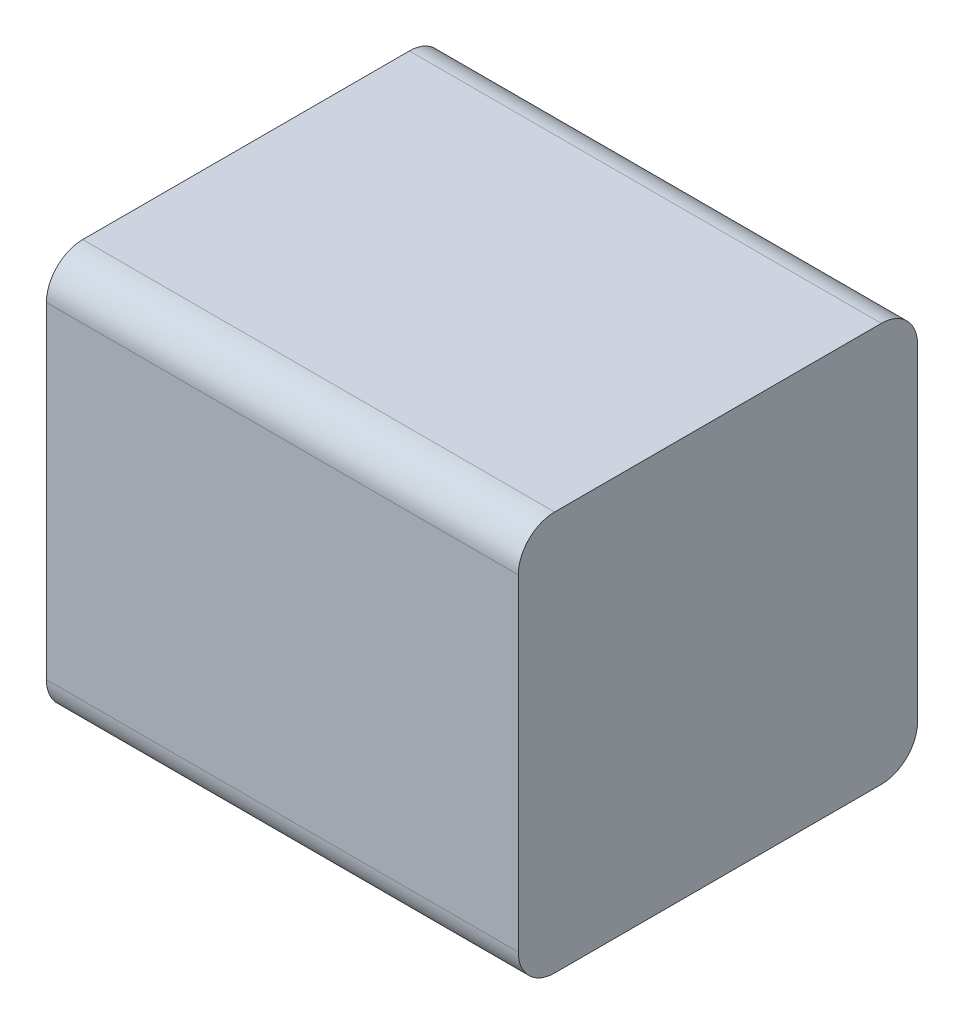
ISO-10303-21;
HEADER;
FILE_DESCRIPTION(('STEP AP214'),'2;1');
FILE_NAME('part.step','',(''),(''),'','','');
FILE_SCHEMA(('AUTOMOTIVE_DESIGN { 1 0 10303 214 1 1 1 1 }'));
ENDSEC;
DATA;
#1=APPLICATION_CONTEXT('core data for automotive mechanical design processes');
#2=APPLICATION_PROTOCOL_DEFINITION('international standard','automotive_design',2000,#1);
#3=PRODUCT_CONTEXT('',#1,'mechanical');
#4=PRODUCT('Part','Part','',(#3));
#5=PRODUCT_RELATED_PRODUCT_CATEGORY('part','',(#4));
#6=PRODUCT_DEFINITION_FORMATION('','',#4);
#7=PRODUCT_DEFINITION_CONTEXT('part definition',#1,'design');
#8=PRODUCT_DEFINITION('design','',#6,#7);
#9=PRODUCT_DEFINITION_SHAPE('','',#8);
#10=(LENGTH_UNIT() NAMED_UNIT(*) SI_UNIT(.MILLI.,.METRE.));
#11=(NAMED_UNIT(*) PLANE_ANGLE_UNIT() SI_UNIT($,.RADIAN.));
#12=(NAMED_UNIT(*) SI_UNIT($,.STERADIAN.) SOLID_ANGLE_UNIT());
#13=UNCERTAINTY_MEASURE_WITH_UNIT(LENGTH_MEASURE(1.E-05),#10,'distance_accuracy_value','');
#14=(GEOMETRIC_REPRESENTATION_CONTEXT(3) GLOBAL_UNCERTAINTY_ASSIGNED_CONTEXT((#13)) GLOBAL_UNIT_ASSIGNED_CONTEXT((#10,
#11,#12)) REPRESENTATION_CONTEXT('',''));
#15=CARTESIAN_POINT('',(0.,0.,0.));
#16=DIRECTION('',(0.,0.,1.));
#17=DIRECTION('',(1.,0.,0.));
#18=AXIS2_PLACEMENT_3D('',#15,#16,#17);
#19=CARTESIAN_POINT('',(0.2,0.,0.));
#20=DIRECTION('',(1.,0.,0.));
#21=DIRECTION('',(0.,0.,-1.));
#22=AXIS2_PLACEMENT_3D('',#19,#20,#21);
#23=PLANE('',#22);
#24=DIRECTION('',(0.,1.,0.));
#25=VECTOR('',#24,1.);
#26=CARTESIAN_POINT('',(0.2,0.,0.55));
#27=LINE('',#26,#25);
#28=CARTESIAN_POINT('',(0.2,0.5,0.55));
#29=VERTEX_POINT('',#28);
#30=CARTESIAN_POINT('',(0.2,0.05,0.55));
#31=VERTEX_POINT('',#30);
#32=EDGE_CURVE('E108',#29,#31,#27,.F.);
#33=ORIENTED_EDGE('',*,*,#32,.F.);
#34=CARTESIAN_POINT('',(0.2,0.5,0.5));
#35=DIRECTION('',(1.,0.,0.));
#36=DIRECTION('',(0.,0.,-1.));
#37=AXIS2_PLACEMENT_3D('',#34,#35,#36);
#38=CIRCLE('',#37,0.05);
#39=CARTESIAN_POINT('',(0.2,0.55,0.5));
#40=VERTEX_POINT('',#39);
#41=EDGE_CURVE('E111',#40,#29,#38,.T.);
#42=ORIENTED_EDGE('',*,*,#41,.F.);
#43=DIRECTION('',(0.,0.,1.));
#44=VECTOR('',#43,1.);
#45=CARTESIAN_POINT('',(0.2,0.55,0.));
#46=LINE('',#45,#44);
#47=CARTESIAN_POINT('',(0.2,0.55,0.05));
#48=VERTEX_POINT('',#47);
#49=EDGE_CURVE('E113',#48,#40,#46,.T.);
#50=ORIENTED_EDGE('',*,*,#49,.F.);
#51=CARTESIAN_POINT('',(0.2,0.5,0.05));
#52=DIRECTION('',(1.,0.,0.));
#53=DIRECTION('',(0.,0.,-1.));
#54=AXIS2_PLACEMENT_3D('',#51,#52,#53);
#55=CIRCLE('',#54,0.05);
#56=CARTESIAN_POINT('',(0.2,0.5,0.));
#57=VERTEX_POINT('',#56);
#58=EDGE_CURVE('E87',#57,#48,#55,.T.);
#59=ORIENTED_EDGE('',*,*,#58,.F.);
#60=DIRECTION('',(0.,1.,0.));
#61=VECTOR('',#60,1.);
#62=CARTESIAN_POINT('',(0.2,0.,0.));
#63=LINE('',#62,#61);
#64=CARTESIAN_POINT('',(0.2,0.05,0.));
#65=VERTEX_POINT('',#64);
#66=EDGE_CURVE('E83',#57,#65,#63,.F.);
#67=ORIENTED_EDGE('',*,*,#66,.T.);
#68=CARTESIAN_POINT('',(0.2,0.05,0.05));
#69=DIRECTION('',(1.,0.,0.));
#70=DIRECTION('',(0.,0.,-1.));
#71=AXIS2_PLACEMENT_3D('',#68,#69,#70);
#72=CIRCLE('',#71,0.05);
#73=CARTESIAN_POINT('',(0.2,0.,0.05));
#74=VERTEX_POINT('',#73);
#75=EDGE_CURVE('E20',#74,#65,#72,.T.);
#76=ORIENTED_EDGE('',*,*,#75,.F.);
#77=DIRECTION('',(0.,0.,1.));
#78=VECTOR('',#77,1.);
#79=CARTESIAN_POINT('',(0.2,0.,0.));
#80=LINE('',#79,#78);
#81=CARTESIAN_POINT('',(0.2,0.,0.5));
#82=VERTEX_POINT('',#81);
#83=EDGE_CURVE('E78',#74,#82,#80,.T.);
#84=ORIENTED_EDGE('',*,*,#83,.T.);
#85=CARTESIAN_POINT('',(0.2,0.05,0.5));
#86=DIRECTION('',(1.,0.,0.));
#87=DIRECTION('',(0.,0.,-1.));
#88=AXIS2_PLACEMENT_3D('',#85,#86,#87);
#89=CIRCLE('',#88,0.05);
#90=EDGE_CURVE('E127',#31,#82,#89,.T.);
#91=ORIENTED_EDGE('',*,*,#90,.F.);
#92=EDGE_LOOP('',(#33,#42,#50,#59,#67,#76,#84,#91));
#93=FACE_BOUND('',#92,.T.);
#94=ADVANCED_FACE('F17',(#93),#23,.F.);
#95=CARTESIAN_POINT('',(0.,0.,0.));
#96=DIRECTION('',(0.,1.,0.));
#97=DIRECTION('',(0.,0.,1.));
#98=AXIS2_PLACEMENT_3D('',#95,#96,#97);
#99=PLANE('',#98);
#100=DIRECTION('',(1.,0.,0.));
#101=VECTOR('',#100,1.);
#102=CARTESIAN_POINT('',(0.,0.,0.5));
#103=LINE('',#102,#101);
#104=CARTESIAN_POINT('',(0.85,0.,0.5));
#105=VERTEX_POINT('',#104);
#106=EDGE_CURVE('E140',#82,#105,#103,.T.);
#107=ORIENTED_EDGE('',*,*,#106,.F.);
#108=ORIENTED_EDGE('',*,*,#83,.F.);
#109=DIRECTION('',(1.,0.,0.));
#110=VECTOR('',#109,1.);
#111=CARTESIAN_POINT('',(0.,0.,0.05));
#112=LINE('',#111,#110);
#113=CARTESIAN_POINT('',(0.85,0.,0.05));
#114=VERTEX_POINT('',#113);
#115=EDGE_CURVE('E97',#114,#74,#112,.F.);
#116=ORIENTED_EDGE('',*,*,#115,.F.);
#117=DIRECTION('',(0.,0.,-1.));
#118=VECTOR('',#117,1.);
#119=CARTESIAN_POINT('',(0.85,0.,0.));
#120=LINE('',#119,#118);
#121=EDGE_CURVE('E126',#105,#114,#120,.T.);
#122=ORIENTED_EDGE('',*,*,#121,.F.);
#123=EDGE_LOOP('',(#107,#108,#116,#122));
#124=FACE_BOUND('',#123,.T.);
#125=ADVANCED_FACE('F160',(#124),#99,.F.);
#126=CARTESIAN_POINT('',(0.,0.05,0.05));
#127=DIRECTION('',(1.,0.,0.));
#128=DIRECTION('',(0.,0.,-1.));
#129=AXIS2_PLACEMENT_3D('',#126,#127,#128);
#130=CYLINDRICAL_SURFACE('',#129,0.05);
#131=DIRECTION('',(1.,0.,0.));
#132=VECTOR('',#131,1.);
#133=CARTESIAN_POINT('',(0.,0.05,0.));
#134=LINE('',#133,#132);
#135=CARTESIAN_POINT('',(0.85,0.05,0.));
#136=VERTEX_POINT('',#135);
#137=EDGE_CURVE('E91',#65,#136,#134,.T.);
#138=ORIENTED_EDGE('',*,*,#137,.T.);
#139=CARTESIAN_POINT('',(0.85,0.05,0.05));
#140=DIRECTION('',(1.,0.,0.));
#141=DIRECTION('',(0.,0.,-1.));
#142=AXIS2_PLACEMENT_3D('',#139,#140,#141);
#143=CIRCLE('',#142,0.05);
#144=EDGE_CURVE('E124',#114,#136,#143,.T.);
#145=ORIENTED_EDGE('',*,*,#144,.F.);
#146=ORIENTED_EDGE('',*,*,#115,.T.);
#147=ORIENTED_EDGE('',*,*,#75,.T.);
#148=EDGE_LOOP('',(#138,#145,#146,#147));
#149=FACE_BOUND('',#148,.T.);
#150=ADVANCED_FACE('F94',(#149),#130,.T.);
#151=CARTESIAN_POINT('',(0.,0.,0.));
#152=DIRECTION('',(0.,0.,1.));
#153=DIRECTION('',(1.,0.,0.));
#154=AXIS2_PLACEMENT_3D('',#151,#152,#153);
#155=PLANE('',#154);
#156=DIRECTION('',(0.,1.,0.));
#157=VECTOR('',#156,1.);
#158=CARTESIAN_POINT('',(0.85,0.,0.));
#159=LINE('',#158,#157);
#160=CARTESIAN_POINT('',(0.85,0.5,0.));
#161=VERTEX_POINT('',#160);
#162=EDGE_CURVE('E100',#136,#161,#159,.T.);
#163=ORIENTED_EDGE('',*,*,#162,.F.);
#164=ORIENTED_EDGE('',*,*,#137,.F.);
#165=ORIENTED_EDGE('',*,*,#66,.F.);
#166=DIRECTION('',(1.,0.,0.));
#167=VECTOR('',#166,1.);
#168=CARTESIAN_POINT('',(0.,0.5,0.));
#169=LINE('',#168,#167);
#170=EDGE_CURVE('E102',#161,#57,#169,.F.);
#171=ORIENTED_EDGE('',*,*,#170,.F.);
#172=EDGE_LOOP('',(#163,#164,#165,#171));
#173=FACE_BOUND('',#172,.T.);
#174=ADVANCED_FACE('F98',(#173),#155,.F.);
#175=CARTESIAN_POINT('',(0.,0.5,0.05));
#176=DIRECTION('',(1.,0.,0.));
#177=DIRECTION('',(0.,0.,-1.));
#178=AXIS2_PLACEMENT_3D('',#175,#176,#177);
#179=CYLINDRICAL_SURFACE('',#178,0.05);
#180=ORIENTED_EDGE('',*,*,#170,.T.);
#181=ORIENTED_EDGE('',*,*,#58,.T.);
#182=DIRECTION('',(1.,0.,0.));
#183=VECTOR('',#182,1.);
#184=CARTESIAN_POINT('',(0.,0.55,0.05));
#185=LINE('',#184,#183);
#186=CARTESIAN_POINT('',(0.85,0.55,0.05));
#187=VERTEX_POINT('',#186);
#188=EDGE_CURVE('E115',#187,#48,#185,.F.);
#189=ORIENTED_EDGE('',*,*,#188,.F.);
#190=CARTESIAN_POINT('',(0.85,0.5,0.05));
#191=DIRECTION('',(1.,0.,0.));
#192=DIRECTION('',(0.,0.,-1.));
#193=AXIS2_PLACEMENT_3D('',#190,#191,#192);
#194=CIRCLE('',#193,0.05);
#195=EDGE_CURVE('E121',#161,#187,#194,.T.);
#196=ORIENTED_EDGE('',*,*,#195,.F.);
#197=EDGE_LOOP('',(#180,#181,#189,#196));
#198=FACE_BOUND('',#197,.T.);
#199=ADVANCED_FACE('F162',(#198),#179,.T.);
#200=CARTESIAN_POINT('',(0.,0.55,0.));
#201=DIRECTION('',(0.,1.,0.));
#202=DIRECTION('',(0.,0.,1.));
#203=AXIS2_PLACEMENT_3D('',#200,#201,#202);
#204=PLANE('',#203);
#205=DIRECTION('',(1.,0.,0.));
#206=VECTOR('',#205,1.);
#207=CARTESIAN_POINT('',(0.,0.55,0.5));
#208=LINE('',#207,#206);
#209=CARTESIAN_POINT('',(0.85,0.55,0.5));
#210=VERTEX_POINT('',#209);
#211=EDGE_CURVE('E114',#210,#40,#208,.F.);
#212=ORIENTED_EDGE('',*,*,#211,.F.);
#213=DIRECTION('',(0.,0.,-1.));
#214=VECTOR('',#213,1.);
#215=CARTESIAN_POINT('',(0.85,0.55,0.));
#216=LINE('',#215,#214);
#217=EDGE_CURVE('E120',#187,#210,#216,.F.);
#218=ORIENTED_EDGE('',*,*,#217,.F.);
#219=ORIENTED_EDGE('',*,*,#188,.T.);
#220=ORIENTED_EDGE('',*,*,#49,.T.);
#221=EDGE_LOOP('',(#212,#218,#219,#220));
#222=FACE_BOUND('',#221,.T.);
#223=ADVANCED_FACE('F163',(#222),#204,.T.);
#224=CARTESIAN_POINT('',(0.,0.5,0.5));
#225=DIRECTION('',(1.,0.,0.));
#226=DIRECTION('',(0.,0.,-1.));
#227=AXIS2_PLACEMENT_3D('',#224,#225,#226);
#228=CYLINDRICAL_SURFACE('',#227,0.05);
#229=DIRECTION('',(1.,0.,0.));
#230=VECTOR('',#229,1.);
#231=CARTESIAN_POINT('',(0.,0.5,0.55));
#232=LINE('',#231,#230);
#233=CARTESIAN_POINT('',(0.85,0.5,0.55));
#234=VERTEX_POINT('',#233);
#235=EDGE_CURVE('E110',#234,#29,#232,.F.);
#236=ORIENTED_EDGE('',*,*,#235,.F.);
#237=CARTESIAN_POINT('',(0.85,0.5,0.5));
#238=DIRECTION('',(1.,0.,0.));
#239=DIRECTION('',(0.,0.,-1.));
#240=AXIS2_PLACEMENT_3D('',#237,#238,#239);
#241=CIRCLE('',#240,0.05);
#242=EDGE_CURVE('E117',#210,#234,#241,.T.);
#243=ORIENTED_EDGE('',*,*,#242,.F.);
#244=ORIENTED_EDGE('',*,*,#211,.T.);
#245=ORIENTED_EDGE('',*,*,#41,.T.);
#246=EDGE_LOOP('',(#236,#243,#244,#245));
#247=FACE_BOUND('',#246,.T.);
#248=ADVANCED_FACE('F156',(#247),#228,.T.);
#249=CARTESIAN_POINT('',(0.,0.,0.55));
#250=DIRECTION('',(0.,0.,1.));
#251=DIRECTION('',(1.,0.,0.));
#252=AXIS2_PLACEMENT_3D('',#249,#250,#251);
#253=PLANE('',#252);
#254=DIRECTION('',(0.,1.,0.));
#255=VECTOR('',#254,1.);
#256=CARTESIAN_POINT('',(0.85,0.,0.55));
#257=LINE('',#256,#255);
#258=CARTESIAN_POINT('',(0.85,0.05,0.55));
#259=VERTEX_POINT('',#258);
#260=EDGE_CURVE('E26',#234,#259,#257,.F.);
#261=ORIENTED_EDGE('',*,*,#260,.F.);
#262=ORIENTED_EDGE('',*,*,#235,.T.);
#263=ORIENTED_EDGE('',*,*,#32,.T.);
#264=DIRECTION('',(1.,0.,0.));
#265=VECTOR('',#264,1.);
#266=CARTESIAN_POINT('',(0.,0.05,0.55));
#267=LINE('',#266,#265);
#268=EDGE_CURVE('E35',#259,#31,#267,.F.);
#269=ORIENTED_EDGE('',*,*,#268,.F.);
#270=EDGE_LOOP('',(#261,#262,#263,#269));
#271=FACE_BOUND('',#270,.T.);
#272=ADVANCED_FACE('F153',(#271),#253,.T.);
#273=CARTESIAN_POINT('',(0.,0.05,0.5));
#274=DIRECTION('',(1.,0.,0.));
#275=DIRECTION('',(0.,0.,-1.));
#276=AXIS2_PLACEMENT_3D('',#273,#274,#275);
#277=CYLINDRICAL_SURFACE('',#276,0.05);
#278=ORIENTED_EDGE('',*,*,#268,.T.);
#279=ORIENTED_EDGE('',*,*,#90,.T.);
#280=ORIENTED_EDGE('',*,*,#106,.T.);
#281=CARTESIAN_POINT('',(0.85,0.05,0.5));
#282=DIRECTION('',(1.,0.,0.));
#283=DIRECTION('',(0.,0.,-1.));
#284=AXIS2_PLACEMENT_3D('',#281,#282,#283);
#285=CIRCLE('',#284,0.05);
#286=EDGE_CURVE('E11',#259,#105,#285,.T.);
#287=ORIENTED_EDGE('',*,*,#286,.F.);
#288=EDGE_LOOP('',(#278,#279,#280,#287));
#289=FACE_BOUND('',#288,.T.);
#290=ADVANCED_FACE('F159',(#289),#277,.T.);
#291=CARTESIAN_POINT('',(0.85,0.,0.));
#292=DIRECTION('',(1.,0.,0.));
#293=DIRECTION('',(0.,0.,-1.));
#294=AXIS2_PLACEMENT_3D('',#291,#292,#293);
#295=PLANE('',#294);
#296=ORIENTED_EDGE('',*,*,#260,.T.);
#297=ORIENTED_EDGE('',*,*,#286,.T.);
#298=ORIENTED_EDGE('',*,*,#121,.T.);
#299=ORIENTED_EDGE('',*,*,#144,.T.);
#300=ORIENTED_EDGE('',*,*,#162,.T.);
#301=ORIENTED_EDGE('',*,*,#195,.T.);
#302=ORIENTED_EDGE('',*,*,#217,.T.);
#303=ORIENTED_EDGE('',*,*,#242,.T.);
#304=EDGE_LOOP('',(#296,#297,#298,#299,#300,#301,#302,#303));
#305=FACE_BOUND('',#304,.T.);
#306=ADVANCED_FACE('F151',(#305),#295,.T.);
#307=CLOSED_SHELL('',(#94,#125,#150,#174,#199,#223,#248,#272,#290,#306));
#308=MANIFOLD_SOLID_BREP('B1',#307);
#309=ADVANCED_BREP_SHAPE_REPRESENTATION('',(#18,#308),#14);
#310=SHAPE_DEFINITION_REPRESENTATION(#9,#309);
ENDSEC;
END-ISO-10303-21;
